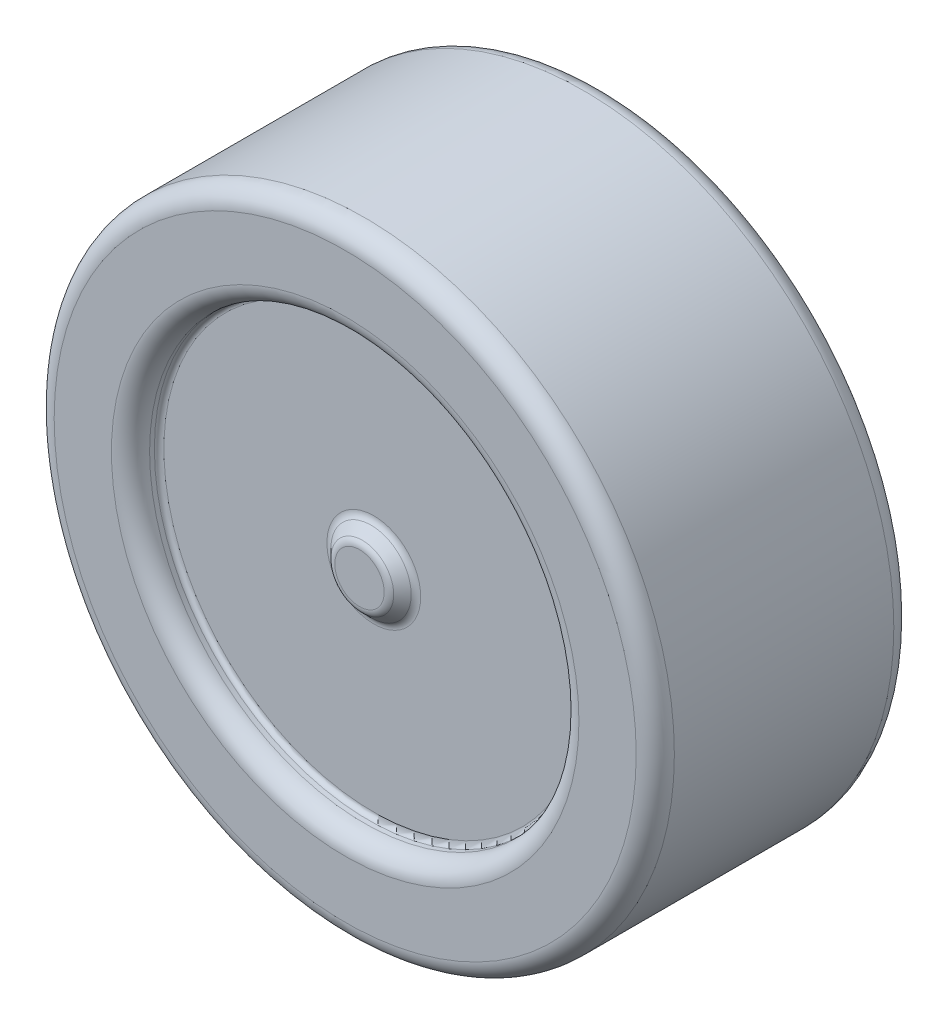
ISO-10303-21;
HEADER;
FILE_DESCRIPTION(('STEP AP214'),'2;1');
FILE_NAME('part.step','',(''),(''),'','','');
FILE_SCHEMA(('AUTOMOTIVE_DESIGN { 1 0 10303 214 1 1 1 1 }'));
ENDSEC;
DATA;
#1=APPLICATION_CONTEXT('core data for automotive mechanical design processes');
#2=APPLICATION_PROTOCOL_DEFINITION('international standard','automotive_design',2000,#1);
#3=PRODUCT_CONTEXT('',#1,'mechanical');
#4=PRODUCT('Part','Part','',(#3));
#5=PRODUCT_RELATED_PRODUCT_CATEGORY('part','',(#4));
#6=PRODUCT_DEFINITION_FORMATION('','',#4);
#7=PRODUCT_DEFINITION_CONTEXT('part definition',#1,'design');
#8=PRODUCT_DEFINITION('design','',#6,#7);
#9=PRODUCT_DEFINITION_SHAPE('','',#8);
#10=(LENGTH_UNIT() NAMED_UNIT(*) SI_UNIT(.MILLI.,.METRE.));
#11=(NAMED_UNIT(*) PLANE_ANGLE_UNIT() SI_UNIT($,.RADIAN.));
#12=(NAMED_UNIT(*) SI_UNIT($,.STERADIAN.) SOLID_ANGLE_UNIT());
#13=UNCERTAINTY_MEASURE_WITH_UNIT(LENGTH_MEASURE(1.E-05),#10,'distance_accuracy_value','');
#14=(GEOMETRIC_REPRESENTATION_CONTEXT(3) GLOBAL_UNCERTAINTY_ASSIGNED_CONTEXT((#13)) GLOBAL_UNIT_ASSIGNED_CONTEXT((#10,
#11,#12)) REPRESENTATION_CONTEXT('',''));
#15=CARTESIAN_POINT('',(0.,0.,0.));
#16=DIRECTION('',(0.,0.,1.));
#17=DIRECTION('',(1.,0.,0.));
#18=AXIS2_PLACEMENT_3D('',#15,#16,#17);
#19=CARTESIAN_POINT('',(0.,0.,-2.));
#20=DIRECTION('',(0.,0.,1.));
#21=DIRECTION('',(1.,0.,0.));
#22=AXIS2_PLACEMENT_3D('',#19,#20,#21);
#23=TOROIDAL_SURFACE('',#22,4.91421356237311,1.);
#24=CARTESIAN_POINT('',(0.,0.,-3.));
#25=DIRECTION('',(0.,0.,1.));
#26=DIRECTION('',(1.,0.,0.));
#27=AXIS2_PLACEMENT_3D('',#24,#25,#26);
#28=CIRCLE('',#27,4.91421356237311);
#29=CARTESIAN_POINT('',(4.91421356237311,0.,-3.));
#30=VERTEX_POINT('',#29);
#31=EDGE_CURVE('E97',#30,#30,#28,.T.);
#32=ORIENTED_EDGE('',*,*,#31,.T.);
#33=EDGE_LOOP('',(#32));
#34=FACE_BOUND('',#33,.T.);
#35=CARTESIAN_POINT('',(0.,0.,-2.70710678118655));
#36=DIRECTION('',(0.,0.,1.));
#37=DIRECTION('',(1.,0.,0.));
#38=AXIS2_PLACEMENT_3D('',#35,#36,#37);
#39=CIRCLE('',#38,4.20710678118656);
#40=CARTESIAN_POINT('',(4.20710678118656,0.,-2.70710678118655));
#41=VERTEX_POINT('',#40);
#42=EDGE_CURVE('E10',#41,#41,#39,.T.);
#43=ORIENTED_EDGE('',*,*,#42,.F.);
#44=EDGE_LOOP('',(#43));
#45=FACE_BOUND('',#44,.T.);
#46=ADVANCED_FACE('F36',(#34,#45),#23,.F.);
#47=CARTESIAN_POINT('',(0.,0.,-1.79289321881345));
#48=DIRECTION('',(0.,0.,-1.));
#49=DIRECTION('',(-1.,0.,0.));
#50=AXIS2_PLACEMENT_3D('',#47,#48,#49);
#51=CONICAL_SURFACE('',#50,3.29289321881345,0.785398163397454);
#52=ORIENTED_EDGE('',*,*,#42,.T.);
#53=EDGE_LOOP('',(#52));
#54=FACE_BOUND('',#53,.T.);
#55=CARTESIAN_POINT('',(0.,0.,-1.79289321881345));
#56=DIRECTION('',(0.,0.,1.));
#57=DIRECTION('',(1.,0.,0.));
#58=AXIS2_PLACEMENT_3D('',#55,#56,#57);
#59=CIRCLE('',#58,3.29289321881345);
#60=CARTESIAN_POINT('',(3.29289321881345,0.,-1.79289321881345));
#61=VERTEX_POINT('',#60);
#62=EDGE_CURVE('E42',#61,#61,#59,.T.);
#63=ORIENTED_EDGE('',*,*,#62,.F.);
#64=EDGE_LOOP('',(#63));
#65=FACE_BOUND('',#64,.T.);
#66=ADVANCED_FACE('F133',(#54,#65),#51,.T.);
#67=CARTESIAN_POINT('',(0.,0.,-2.5));
#68=DIRECTION('',(0.,0.,1.));
#69=DIRECTION('',(1.,0.,0.));
#70=AXIS2_PLACEMENT_3D('',#67,#68,#69);
#71=TOROIDAL_SURFACE('',#70,2.58578643762691,1.);
#72=CARTESIAN_POINT('',(0.,0.,-1.5));
#73=DIRECTION('',(0.,0.,1.));
#74=DIRECTION('',(1.,0.,0.));
#75=AXIS2_PLACEMENT_3D('',#72,#73,#74);
#76=CIRCLE('',#75,2.58578643762691);
#77=CARTESIAN_POINT('',(2.58578643762691,0.,-1.5));
#78=VERTEX_POINT('',#77);
#79=EDGE_CURVE('E46',#78,#78,#76,.T.);
#80=ORIENTED_EDGE('',*,*,#79,.F.);
#81=EDGE_LOOP('',(#80));
#82=FACE_BOUND('',#81,.T.);
#83=ORIENTED_EDGE('',*,*,#62,.T.);
#84=EDGE_LOOP('',(#83));
#85=FACE_BOUND('',#84,.T.);
#86=ADVANCED_FACE('F137',(#82,#85),#71,.T.);
#87=CARTESIAN_POINT('',(0.,0.,-1.5));
#88=DIRECTION('',(0.,0.,1.));
#89=DIRECTION('',(1.,0.,0.));
#90=AXIS2_PLACEMENT_3D('',#87,#88,#89);
#91=PLANE('',#90);
#92=ORIENTED_EDGE('',*,*,#79,.T.);
#93=EDGE_LOOP('',(#92));
#94=FACE_BOUND('',#93,.T.);
#95=ADVANCED_FACE('F141',(#94),#91,.T.);
#96=CARTESIAN_POINT('',(0.,0.,-20.));
#97=DIRECTION('',(0.,0.,1.));
#98=DIRECTION('',(1.,0.,0.));
#99=AXIS2_PLACEMENT_3D('',#96,#97,#98);
#100=PLANE('',#99);
#101=CARTESIAN_POINT('',(0.,0.,-20.));
#102=DIRECTION('',(0.,0.,1.));
#103=DIRECTION('',(1.,0.,0.));
#104=AXIS2_PLACEMENT_3D('',#101,#102,#103);
#105=CIRCLE('',#104,6.);
#106=CARTESIAN_POINT('',(6.,0.,-20.));
#107=VERTEX_POINT('',#106);
#108=EDGE_CURVE('E50',#107,#107,#105,.T.);
#109=ORIENTED_EDGE('',*,*,#108,.F.);
#110=EDGE_LOOP('',(#109));
#111=FACE_BOUND('',#110,.T.);
#112=ADVANCED_FACE('F148',(#111),#100,.F.);
#113=CARTESIAN_POINT('',(0.,0.,0.));
#114=DIRECTION('',(0.,0.,1.));
#115=DIRECTION('',(1.,0.,0.));
#116=AXIS2_PLACEMENT_3D('',#113,#114,#115);
#117=CYLINDRICAL_SURFACE('',#116,6.);
#118=CARTESIAN_POINT('',(0.,0.,-12.));
#119=DIRECTION('',(0.,0.,1.));
#120=DIRECTION('',(1.,0.,0.));
#121=AXIS2_PLACEMENT_3D('',#118,#119,#120);
#122=CIRCLE('',#121,6.);
#123=CARTESIAN_POINT('',(6.,0.,-12.));
#124=VERTEX_POINT('',#123);
#125=EDGE_CURVE('E55',#124,#124,#122,.T.);
#126=ORIENTED_EDGE('',*,*,#125,.F.);
#127=EDGE_LOOP('',(#126));
#128=FACE_BOUND('',#127,.T.);
#129=ORIENTED_EDGE('',*,*,#108,.T.);
#130=EDGE_LOOP('',(#129));
#131=FACE_BOUND('',#130,.T.);
#132=ADVANCED_FACE('F152',(#128,#131),#117,.T.);
#133=CARTESIAN_POINT('',(0.,0.,-12.));
#134=DIRECTION('',(0.,0.,1.));
#135=DIRECTION('',(1.,0.,0.));
#136=AXIS2_PLACEMENT_3D('',#133,#134,#135);
#137=TOROIDAL_SURFACE('',#136,8.,2.);
#138=CARTESIAN_POINT('',(0.,0.,-10.));
#139=DIRECTION('',(0.,0.,1.));
#140=DIRECTION('',(1.,0.,0.));
#141=AXIS2_PLACEMENT_3D('',#138,#139,#140);
#142=CIRCLE('',#141,8.00000000000001);
#143=CARTESIAN_POINT('',(8.00000000000001,0.,-10.));
#144=VERTEX_POINT('',#143);
#145=EDGE_CURVE('E58',#144,#144,#142,.T.);
#146=ORIENTED_EDGE('',*,*,#145,.F.);
#147=EDGE_LOOP('',(#146));
#148=FACE_BOUND('',#147,.T.);
#149=ORIENTED_EDGE('',*,*,#125,.T.);
#150=EDGE_LOOP('',(#149));
#151=FACE_BOUND('',#150,.T.);
#152=ADVANCED_FACE('F156',(#148,#151),#137,.F.);
#153=CARTESIAN_POINT('',(0.,0.,-10.));
#154=DIRECTION('',(0.,0.,-1.));
#155=DIRECTION('',(-1.,0.,0.));
#156=AXIS2_PLACEMENT_3D('',#153,#154,#155);
#157=PLANE('',#156);
#158=ORIENTED_EDGE('',*,*,#145,.T.);
#159=EDGE_LOOP('',(#158));
#160=FACE_BOUND('',#159,.T.);
#161=CARTESIAN_POINT('',(0.,0.,-10.));
#162=DIRECTION('',(0.,0.,1.));
#163=DIRECTION('',(1.,0.,0.));
#164=AXIS2_PLACEMENT_3D('',#161,#162,#163);
#165=CIRCLE('',#164,20.5);
#166=CARTESIAN_POINT('',(20.5,0.,-10.));
#167=VERTEX_POINT('',#166);
#168=EDGE_CURVE('E61',#167,#167,#165,.T.);
#169=ORIENTED_EDGE('',*,*,#168,.F.);
#170=EDGE_LOOP('',(#169));
#171=FACE_BOUND('',#170,.T.);
#172=ADVANCED_FACE('F160',(#160,#171),#157,.T.);
#173=CARTESIAN_POINT('',(0.,0.,-12.));
#174=DIRECTION('',(0.,0.,1.));
#175=DIRECTION('',(1.,0.,0.));
#176=AXIS2_PLACEMENT_3D('',#173,#174,#175);
#177=TOROIDAL_SURFACE('',#176,20.5,2.);
#178=CARTESIAN_POINT('',(0.,0.,-12.));
#179=DIRECTION('',(0.,0.,1.));
#180=DIRECTION('',(1.,0.,0.));
#181=AXIS2_PLACEMENT_3D('',#178,#179,#180);
#182=CIRCLE('',#181,22.5);
#183=CARTESIAN_POINT('',(22.5,0.,-12.));
#184=VERTEX_POINT('',#183);
#185=EDGE_CURVE('E64',#184,#184,#182,.T.);
#186=ORIENTED_EDGE('',*,*,#185,.F.);
#187=EDGE_LOOP('',(#186));
#188=FACE_BOUND('',#187,.T.);
#189=ORIENTED_EDGE('',*,*,#168,.T.);
#190=EDGE_LOOP('',(#189));
#191=FACE_BOUND('',#190,.T.);
#192=ADVANCED_FACE('F164',(#188,#191),#177,.F.);
#193=CARTESIAN_POINT('',(0.,0.,0.));
#194=DIRECTION('',(0.,0.,1.));
#195=DIRECTION('',(1.,0.,0.));
#196=AXIS2_PLACEMENT_3D('',#193,#194,#195);
#197=CYLINDRICAL_SURFACE('',#196,22.5);
#198=ORIENTED_EDGE('',*,*,#185,.T.);
#199=EDGE_LOOP('',(#198));
#200=FACE_BOUND('',#199,.T.);
#201=CARTESIAN_POINT('',(0.,0.,-25.));
#202=DIRECTION('',(0.,0.,1.));
#203=DIRECTION('',(1.,0.,0.));
#204=AXIS2_PLACEMENT_3D('',#201,#202,#203);
#205=CIRCLE('',#204,22.5);
#206=CARTESIAN_POINT('',(22.5,0.,-25.));
#207=VERTEX_POINT('',#206);
#208=EDGE_CURVE('E67',#207,#207,#205,.T.);
#209=ORIENTED_EDGE('',*,*,#208,.F.);
#210=EDGE_LOOP('',(#209));
#211=FACE_BOUND('',#210,.T.);
#212=ADVANCED_FACE('F168',(#200,#211),#197,.F.);
#213=CARTESIAN_POINT('',(0.,0.,-25.));
#214=DIRECTION('',(0.,0.,1.));
#215=DIRECTION('',(1.,0.,0.));
#216=AXIS2_PLACEMENT_3D('',#213,#214,#215);
#217=TOROIDAL_SURFACE('',#216,24.5,2.);
#218=ORIENTED_EDGE('',*,*,#208,.T.);
#219=EDGE_LOOP('',(#218));
#220=FACE_BOUND('',#219,.T.);
#221=CARTESIAN_POINT('',(0.,0.,-27.));
#222=DIRECTION('',(0.,0.,1.));
#223=DIRECTION('',(1.,0.,0.));
#224=AXIS2_PLACEMENT_3D('',#221,#222,#223);
#225=CIRCLE('',#224,24.5);
#226=CARTESIAN_POINT('',(24.5,0.,-27.));
#227=VERTEX_POINT('',#226);
#228=EDGE_CURVE('E70',#227,#227,#225,.T.);
#229=ORIENTED_EDGE('',*,*,#228,.F.);
#230=EDGE_LOOP('',(#229));
#231=FACE_BOUND('',#230,.T.);
#232=ADVANCED_FACE('F172',(#220,#231),#217,.T.);
#233=CARTESIAN_POINT('',(0.,0.,-27.));
#234=DIRECTION('',(0.,0.,-1.));
#235=DIRECTION('',(-1.,0.,0.));
#236=AXIS2_PLACEMENT_3D('',#233,#234,#235);
#237=PLANE('',#236);
#238=ORIENTED_EDGE('',*,*,#228,.T.);
#239=EDGE_LOOP('',(#238));
#240=FACE_BOUND('',#239,.T.);
#241=CARTESIAN_POINT('',(0.,0.,-27.));
#242=DIRECTION('',(0.,0.,1.));
#243=DIRECTION('',(1.,0.,0.));
#244=AXIS2_PLACEMENT_3D('',#241,#242,#243);
#245=CIRCLE('',#244,30.5);
#246=CARTESIAN_POINT('',(30.5,0.,-27.));
#247=VERTEX_POINT('',#246);
#248=EDGE_CURVE('E73',#247,#247,#245,.T.);
#249=ORIENTED_EDGE('',*,*,#248,.F.);
#250=EDGE_LOOP('',(#249));
#251=FACE_BOUND('',#250,.T.);
#252=ADVANCED_FACE('F176',(#240,#251),#237,.T.);
#253=CARTESIAN_POINT('',(0.,0.,-25.));
#254=DIRECTION('',(0.,0.,1.));
#255=DIRECTION('',(1.,0.,0.));
#256=AXIS2_PLACEMENT_3D('',#253,#254,#255);
#257=TOROIDAL_SURFACE('',#256,30.5,2.);
#258=ORIENTED_EDGE('',*,*,#248,.T.);
#259=EDGE_LOOP('',(#258));
#260=FACE_BOUND('',#259,.T.);
#261=CARTESIAN_POINT('',(0.,0.,-25.));
#262=DIRECTION('',(0.,0.,1.));
#263=DIRECTION('',(1.,0.,0.));
#264=AXIS2_PLACEMENT_3D('',#261,#262,#263);
#265=CIRCLE('',#264,32.5);
#266=CARTESIAN_POINT('',(32.5,0.,-25.));
#267=VERTEX_POINT('',#266);
#268=EDGE_CURVE('E76',#267,#267,#265,.T.);
#269=ORIENTED_EDGE('',*,*,#268,.F.);
#270=EDGE_LOOP('',(#269));
#271=FACE_BOUND('',#270,.T.);
#272=ADVANCED_FACE('F180',(#260,#271),#257,.T.);
#273=CARTESIAN_POINT('',(0.,0.,0.));
#274=DIRECTION('',(0.,0.,1.));
#275=DIRECTION('',(1.,0.,0.));
#276=AXIS2_PLACEMENT_3D('',#273,#274,#275);
#277=CYLINDRICAL_SURFACE('',#276,32.5);
#278=ORIENTED_EDGE('',*,*,#268,.T.);
#279=EDGE_LOOP('',(#278));
#280=FACE_BOUND('',#279,.T.);
#281=CARTESIAN_POINT('',(0.,0.,-2.00000000000001));
#282=DIRECTION('',(0.,0.,1.));
#283=DIRECTION('',(1.,0.,0.));
#284=AXIS2_PLACEMENT_3D('',#281,#282,#283);
#285=CIRCLE('',#284,32.5);
#286=CARTESIAN_POINT('',(32.5,0.,-2.00000000000001));
#287=VERTEX_POINT('',#286);
#288=EDGE_CURVE('E79',#287,#287,#285,.T.);
#289=ORIENTED_EDGE('',*,*,#288,.F.);
#290=EDGE_LOOP('',(#289));
#291=FACE_BOUND('',#290,.T.);
#292=ADVANCED_FACE('F184',(#280,#291),#277,.T.);
#293=CARTESIAN_POINT('',(0.,0.,-2.));
#294=DIRECTION('',(0.,0.,1.));
#295=DIRECTION('',(1.,0.,0.));
#296=AXIS2_PLACEMENT_3D('',#293,#294,#295);
#297=TOROIDAL_SURFACE('',#296,30.5,2.);
#298=ORIENTED_EDGE('',*,*,#288,.T.);
#299=EDGE_LOOP('',(#298));
#300=FACE_BOUND('',#299,.T.);
#301=CARTESIAN_POINT('',(0.,0.,0.));
#302=DIRECTION('',(0.,0.,1.));
#303=DIRECTION('',(1.,0.,0.));
#304=AXIS2_PLACEMENT_3D('',#301,#302,#303);
#305=CIRCLE('',#304,30.5);
#306=CARTESIAN_POINT('',(30.5,0.,0.));
#307=VERTEX_POINT('',#306);
#308=EDGE_CURVE('E82',#307,#307,#305,.T.);
#309=ORIENTED_EDGE('',*,*,#308,.F.);
#310=EDGE_LOOP('',(#309));
#311=FACE_BOUND('',#310,.T.);
#312=ADVANCED_FACE('F129',(#300,#311),#297,.T.);
#313=CARTESIAN_POINT('',(0.,0.,0.));
#314=DIRECTION('',(0.,0.,1.));
#315=DIRECTION('',(1.,0.,0.));
#316=AXIS2_PLACEMENT_3D('',#313,#314,#315);
#317=PLANE('',#316);
#318=ORIENTED_EDGE('',*,*,#308,.T.);
#319=EDGE_LOOP('',(#318));
#320=FACE_BOUND('',#319,.T.);
#321=CARTESIAN_POINT('',(0.,0.,0.));
#322=DIRECTION('',(0.,0.,1.));
#323=DIRECTION('',(1.,0.,0.));
#324=AXIS2_PLACEMENT_3D('',#321,#322,#323);
#325=CIRCLE('',#324,24.5);
#326=CARTESIAN_POINT('',(24.5,0.,0.));
#327=VERTEX_POINT('',#326);
#328=EDGE_CURVE('E85',#327,#327,#325,.T.);
#329=ORIENTED_EDGE('',*,*,#328,.F.);
#330=EDGE_LOOP('',(#329));
#331=FACE_BOUND('',#330,.T.);
#332=ADVANCED_FACE('F123',(#320,#331),#317,.T.);
#333=CARTESIAN_POINT('',(0.,0.,-2.));
#334=DIRECTION('',(0.,0.,1.));
#335=DIRECTION('',(1.,0.,0.));
#336=AXIS2_PLACEMENT_3D('',#333,#334,#335);
#337=TOROIDAL_SURFACE('',#336,24.5,2.);
#338=ORIENTED_EDGE('',*,*,#328,.T.);
#339=EDGE_LOOP('',(#338));
#340=FACE_BOUND('',#339,.T.);
#341=CARTESIAN_POINT('',(0.,0.,-2.00000000000001));
#342=DIRECTION('',(0.,0.,1.));
#343=DIRECTION('',(1.,0.,0.));
#344=AXIS2_PLACEMENT_3D('',#341,#342,#343);
#345=CIRCLE('',#344,22.5);
#346=CARTESIAN_POINT('',(22.5,0.,-2.00000000000001));
#347=VERTEX_POINT('',#346);
#348=EDGE_CURVE('E88',#347,#347,#345,.T.);
#349=ORIENTED_EDGE('',*,*,#348,.F.);
#350=EDGE_LOOP('',(#349));
#351=FACE_BOUND('',#350,.T.);
#352=ADVANCED_FACE('F118',(#340,#351),#337,.T.);
#353=CARTESIAN_POINT('',(0.,0.,0.));
#354=DIRECTION('',(0.,0.,1.));
#355=DIRECTION('',(1.,0.,0.));
#356=AXIS2_PLACEMENT_3D('',#353,#354,#355);
#357=CYLINDRICAL_SURFACE('',#356,22.5);
#358=CARTESIAN_POINT('',(0.,0.,-2.49999999999999));
#359=DIRECTION('',(0.,0.,1.));
#360=DIRECTION('',(1.,0.,0.));
#361=AXIS2_PLACEMENT_3D('',#358,#359,#360);
#362=CIRCLE('',#361,22.5);
#363=CARTESIAN_POINT('',(22.5,0.,-2.49999999999999));
#364=VERTEX_POINT('',#363);
#365=EDGE_CURVE('E91',#364,#364,#362,.T.);
#366=ORIENTED_EDGE('',*,*,#365,.F.);
#367=EDGE_LOOP('',(#366));
#368=FACE_BOUND('',#367,.T.);
#369=ORIENTED_EDGE('',*,*,#348,.T.);
#370=EDGE_LOOP('',(#369));
#371=FACE_BOUND('',#370,.T.);
#372=ADVANCED_FACE('F112',(#368,#371),#357,.F.);
#373=CARTESIAN_POINT('',(0.,0.,-2.5));
#374=DIRECTION('',(0.,0.,1.));
#375=DIRECTION('',(1.,0.,0.));
#376=AXIS2_PLACEMENT_3D('',#373,#374,#375);
#377=TOROIDAL_SURFACE('',#376,22.,0.5);
#378=CARTESIAN_POINT('',(0.,0.,-3.));
#379=DIRECTION('',(0.,0.,1.));
#380=DIRECTION('',(1.,0.,0.));
#381=AXIS2_PLACEMENT_3D('',#378,#379,#380);
#382=CIRCLE('',#381,22.);
#383=CARTESIAN_POINT('',(22.,0.,-3.));
#384=VERTEX_POINT('',#383);
#385=EDGE_CURVE('E94',#384,#384,#382,.T.);
#386=ORIENTED_EDGE('',*,*,#385,.F.);
#387=EDGE_LOOP('',(#386));
#388=FACE_BOUND('',#387,.T.);
#389=ORIENTED_EDGE('',*,*,#365,.T.);
#390=EDGE_LOOP('',(#389));
#391=FACE_BOUND('',#390,.T.);
#392=ADVANCED_FACE('F106',(#388,#391),#377,.F.);
#393=CARTESIAN_POINT('',(0.,0.,-3.));
#394=DIRECTION('',(0.,0.,-1.));
#395=DIRECTION('',(-1.,0.,0.));
#396=AXIS2_PLACEMENT_3D('',#393,#394,#395);
#397=PLANE('',#396);
#398=ORIENTED_EDGE('',*,*,#31,.F.);
#399=EDGE_LOOP('',(#398));
#400=FACE_BOUND('',#399,.T.);
#401=ORIENTED_EDGE('',*,*,#385,.T.);
#402=EDGE_LOOP('',(#401));
#403=FACE_BOUND('',#402,.T.);
#404=ADVANCED_FACE('F103',(#400,#403),#397,.F.);
#405=CLOSED_SHELL('',(#46,#66,#86,#95,#112,#132,#152,#172,#192,#212,#232,#252,#272,#292,#312,
#332,#352,#372,#392,#404));
#406=MANIFOLD_SOLID_BREP('B2',#405);
#407=ADVANCED_BREP_SHAPE_REPRESENTATION('',(#18,#406),#14);
#408=SHAPE_DEFINITION_REPRESENTATION(#9,#407);
ENDSEC;
END-ISO-10303-21;
